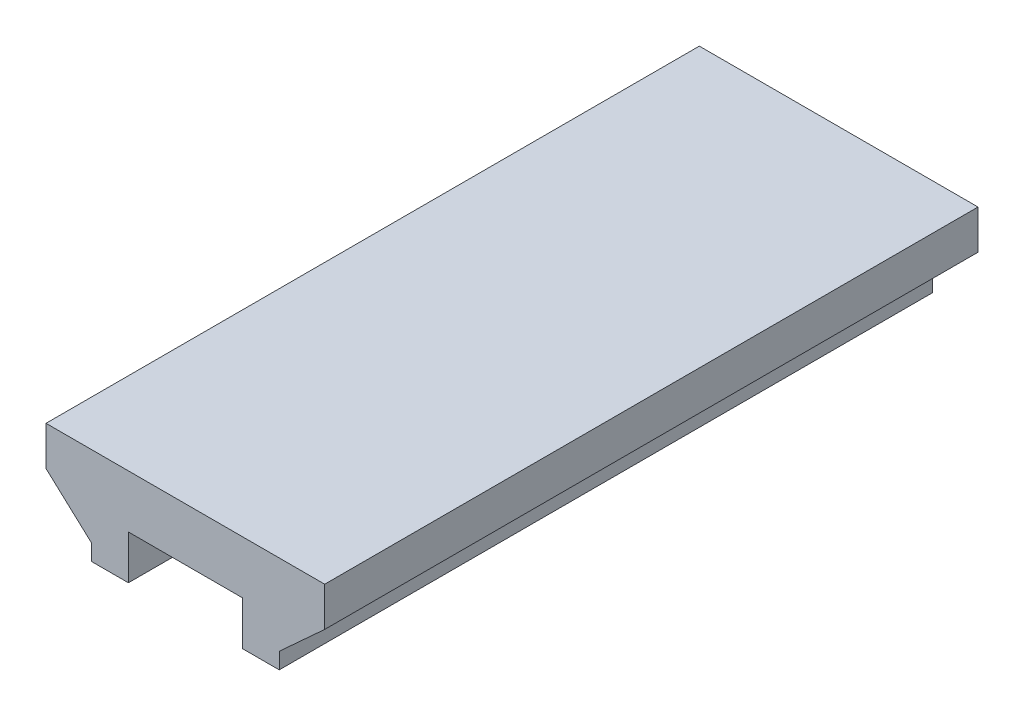
ISO-10303-21;
HEADER;
FILE_DESCRIPTION(('STEP AP214'),'2;1');
FILE_NAME('part.step','',(''),(''),'','','');
FILE_SCHEMA(('AUTOMOTIVE_DESIGN { 1 0 10303 214 1 1 1 1 }'));
ENDSEC;
DATA;
#1=APPLICATION_CONTEXT('core data for automotive mechanical design processes');
#2=APPLICATION_PROTOCOL_DEFINITION('international standard','automotive_design',2000,#1);
#3=PRODUCT_CONTEXT('',#1,'mechanical');
#4=PRODUCT('Part','Part','',(#3));
#5=PRODUCT_RELATED_PRODUCT_CATEGORY('part','',(#4));
#6=PRODUCT_DEFINITION_FORMATION('','',#4);
#7=PRODUCT_DEFINITION_CONTEXT('part definition',#1,'design');
#8=PRODUCT_DEFINITION('design','',#6,#7);
#9=PRODUCT_DEFINITION_SHAPE('','',#8);
#10=(LENGTH_UNIT() NAMED_UNIT(*) SI_UNIT(.MILLI.,.METRE.));
#11=(NAMED_UNIT(*) PLANE_ANGLE_UNIT() SI_UNIT($,.RADIAN.));
#12=(NAMED_UNIT(*) SI_UNIT($,.STERADIAN.) SOLID_ANGLE_UNIT());
#13=UNCERTAINTY_MEASURE_WITH_UNIT(LENGTH_MEASURE(1.E-05),#10,'distance_accuracy_value','');
#14=(GEOMETRIC_REPRESENTATION_CONTEXT(3) GLOBAL_UNCERTAINTY_ASSIGNED_CONTEXT((#13)) GLOBAL_UNIT_ASSIGNED_CONTEXT((#10,
#11,#12)) REPRESENTATION_CONTEXT('',''));
#15=CARTESIAN_POINT('',(0.,0.,0.));
#16=DIRECTION('',(0.,0.,1.));
#17=DIRECTION('',(1.,0.,0.));
#18=AXIS2_PLACEMENT_3D('',#15,#16,#17);
#19=CARTESIAN_POINT('',(20.6600264011001,1430.,-89.8499999999971));
#20=DIRECTION('',(0.,0.,1.));
#21=DIRECTION('',(1.,0.,0.));
#22=AXIS2_PLACEMENT_3D('',#19,#20,#21);
#23=PLANE('',#22);
#24=DIRECTION('',(0.737562216224667,0.67527918463237,0.));
#25=VECTOR('',#24,1.);
#26=CARTESIAN_POINT('',(-167.5,1561.,-89.8499999999971));
#27=LINE('',#26,#25);
#28=CARTESIAN_POINT('',(-167.5,1561.,-89.8499999999971));
#29=VERTEX_POINT('',#28);
#30=CARTESIAN_POINT('',(-55.,1664.,-89.8499999999971));
#31=VERTEX_POINT('',#30);
#32=EDGE_CURVE('E41',#29,#31,#27,.T.);
#33=ORIENTED_EDGE('',*,*,#32,.F.);
#34=DIRECTION('',(0.,1.,0.));
#35=VECTOR('',#34,1.);
#36=CARTESIAN_POINT('',(-167.5,1521.,-89.8499999999971));
#37=LINE('',#36,#35);
#38=CARTESIAN_POINT('',(-167.5,1521.,-89.8499999999971));
#39=VERTEX_POINT('',#38);
#40=EDGE_CURVE('E254',#39,#29,#37,.T.);
#41=ORIENTED_EDGE('',*,*,#40,.F.);
#42=DIRECTION('',(1.,0.,0.));
#43=VECTOR('',#42,1.);
#44=CARTESIAN_POINT('',(-259.,1521.,-89.8499999999971));
#45=LINE('',#44,#43);
#46=CARTESIAN_POINT('',(-259.,1521.,-89.8499999999971));
#47=VERTEX_POINT('',#46);
#48=EDGE_CURVE('E196',#47,#39,#45,.T.);
#49=ORIENTED_EDGE('',*,*,#48,.F.);
#50=DIRECTION('',(0.,-1.,0.));
#51=VECTOR('',#50,1.);
#52=CARTESIAN_POINT('',(-259.,1630.,-89.8499999999971));
#53=LINE('',#52,#51);
#54=CARTESIAN_POINT('',(-259.,1630.,-89.8499999999971));
#55=VERTEX_POINT('',#54);
#56=EDGE_CURVE('E195',#55,#47,#53,.T.);
#57=ORIENTED_EDGE('',*,*,#56,.F.);
#58=DIRECTION('',(1.,0.,0.));
#59=VECTOR('',#58,1.);
#60=CARTESIAN_POINT('',(-541.,1630.,-89.8499999999971));
#61=LINE('',#60,#59);
#62=CARTESIAN_POINT('',(-541.,1630.,-89.8499999999971));
#63=VERTEX_POINT('',#62);
#64=EDGE_CURVE('E203',#63,#55,#61,.T.);
#65=ORIENTED_EDGE('',*,*,#64,.F.);
#66=DIRECTION('',(0.,1.,0.));
#67=VECTOR('',#66,1.);
#68=CARTESIAN_POINT('',(-541.,1521.,-89.8499999999971));
#69=LINE('',#68,#67);
#70=CARTESIAN_POINT('',(-541.,1521.,-89.8499999999971));
#71=VERTEX_POINT('',#70);
#72=EDGE_CURVE('E153',#71,#63,#69,.T.);
#73=ORIENTED_EDGE('',*,*,#72,.F.);
#74=DIRECTION('',(1.,0.,0.));
#75=VECTOR('',#74,1.);
#76=CARTESIAN_POINT('',(-632.,1521.,-89.8499999999971));
#77=LINE('',#76,#75);
#78=CARTESIAN_POINT('',(-632.,1521.,-89.8499999999971));
#79=VERTEX_POINT('',#78);
#80=EDGE_CURVE('E148',#79,#71,#77,.T.);
#81=ORIENTED_EDGE('',*,*,#80,.F.);
#82=DIRECTION('',(0.,-1.,0.));
#83=VECTOR('',#82,1.);
#84=CARTESIAN_POINT('',(-632.,1560.54222222222,-89.8499999999971));
#85=LINE('',#84,#83);
#86=CARTESIAN_POINT('',(-632.,1560.54222222222,-89.8499999999971));
#87=VERTEX_POINT('',#86);
#88=EDGE_CURVE('E150',#87,#79,#85,.T.);
#89=ORIENTED_EDGE('',*,*,#88,.F.);
#90=DIRECTION('',(0.737562216224667,-0.67527918463237,0.));
#91=VECTOR('',#90,1.);
#92=CARTESIAN_POINT('',(-745.,1664.,-89.8499999999971));
#93=LINE('',#92,#91);
#94=CARTESIAN_POINT('',(-745.,1664.,-89.8499999999971));
#95=VERTEX_POINT('',#94);
#96=EDGE_CURVE('E176',#95,#87,#93,.T.);
#97=ORIENTED_EDGE('',*,*,#96,.F.);
#98=DIRECTION('',(0.,1.,0.));
#99=VECTOR('',#98,1.);
#100=CARTESIAN_POINT('',(-745.,1664.,-89.8499999999971));
#101=LINE('',#100,#99);
#102=CARTESIAN_POINT('',(-745.,1761.,-89.8499999999971));
#103=VERTEX_POINT('',#102);
#104=EDGE_CURVE('E11',#95,#103,#101,.T.);
#105=ORIENTED_EDGE('',*,*,#104,.T.);
#106=DIRECTION('',(-1.,0.,0.));
#107=VECTOR('',#106,1.);
#108=CARTESIAN_POINT('',(-55.,1761.,-89.8499999999971));
#109=LINE('',#108,#107);
#110=CARTESIAN_POINT('',(-55.,1761.,-89.8499999999971));
#111=VERTEX_POINT('',#110);
#112=EDGE_CURVE('E128',#111,#103,#109,.T.);
#113=ORIENTED_EDGE('',*,*,#112,.F.);
#114=DIRECTION('',(0.,1.,0.));
#115=VECTOR('',#114,1.);
#116=CARTESIAN_POINT('',(-55.,1664.,-89.8499999999971));
#117=LINE('',#116,#115);
#118=EDGE_CURVE('E28',#31,#111,#117,.T.);
#119=ORIENTED_EDGE('',*,*,#118,.F.);
#120=EDGE_LOOP('',(#33,#41,#49,#57,#65,#73,#81,#89,#97,#105,#113,#119));
#121=FACE_BOUND('',#120,.T.);
#122=ADVANCED_FACE('F17',(#121),#23,.F.);
#123=CARTESIAN_POINT('',(-55.,1664.,-89.8499999999971));
#124=DIRECTION('',(1.,0.,0.));
#125=DIRECTION('',(0.,0.,1.));
#126=AXIS2_PLACEMENT_3D('',#123,#124,#125);
#127=PLANE('',#126);
#128=DIRECTION('',(0.,0.,1.));
#129=VECTOR('',#128,1.);
#130=CARTESIAN_POINT('',(-55.,1664.,-89.8499999999971));
#131=LINE('',#130,#129);
#132=CARTESIAN_POINT('',(-55.,1664.,1527.65));
#133=VERTEX_POINT('',#132);
#134=EDGE_CURVE('E257',#31,#133,#131,.T.);
#135=ORIENTED_EDGE('',*,*,#134,.F.);
#136=ORIENTED_EDGE('',*,*,#118,.T.);
#137=DIRECTION('',(0.,0.,-1.));
#138=VECTOR('',#137,1.);
#139=CARTESIAN_POINT('',(-55.,1761.,1527.65));
#140=LINE('',#139,#138);
#141=CARTESIAN_POINT('',(-55.,1761.,1527.65));
#142=VERTEX_POINT('',#141);
#143=EDGE_CURVE('E185',#142,#111,#140,.T.);
#144=ORIENTED_EDGE('',*,*,#143,.F.);
#145=DIRECTION('',(0.,-1.,0.));
#146=VECTOR('',#145,1.);
#147=CARTESIAN_POINT('',(-55.,1761.,1527.65));
#148=LINE('',#147,#146);
#149=EDGE_CURVE('E207',#142,#133,#148,.T.);
#150=ORIENTED_EDGE('',*,*,#149,.T.);
#151=EDGE_LOOP('',(#135,#136,#144,#150));
#152=FACE_BOUND('',#151,.T.);
#153=ADVANCED_FACE('F281',(#152),#127,.T.);
#154=CARTESIAN_POINT('',(-400.,1521.,1527.65));
#155=DIRECTION('',(0.,0.,1.));
#156=DIRECTION('',(1.,0.,0.));
#157=AXIS2_PLACEMENT_3D('',#154,#155,#156);
#158=PLANE('',#157);
#159=DIRECTION('',(0.737562216224667,-0.67527918463237,0.));
#160=VECTOR('',#159,1.);
#161=CARTESIAN_POINT('',(-745.,1664.,1527.65));
#162=LINE('',#161,#160);
#163=CARTESIAN_POINT('',(-745.,1664.,1527.65));
#164=VERTEX_POINT('',#163);
#165=CARTESIAN_POINT('',(-632.,1560.54222222222,1527.65));
#166=VERTEX_POINT('',#165);
#167=EDGE_CURVE('E215',#164,#166,#162,.T.);
#168=ORIENTED_EDGE('',*,*,#167,.T.);
#169=DIRECTION('',(0.,-1.,0.));
#170=VECTOR('',#169,1.);
#171=CARTESIAN_POINT('',(-632.,1560.54222222222,1527.65));
#172=LINE('',#171,#170);
#173=CARTESIAN_POINT('',(-632.,1521.,1527.65));
#174=VERTEX_POINT('',#173);
#175=EDGE_CURVE('E212',#166,#174,#172,.T.);
#176=ORIENTED_EDGE('',*,*,#175,.T.);
#177=DIRECTION('',(1.,0.,0.));
#178=VECTOR('',#177,1.);
#179=CARTESIAN_POINT('',(-632.,1521.,1527.65));
#180=LINE('',#179,#178);
#181=CARTESIAN_POINT('',(-541.,1521.,1527.65));
#182=VERTEX_POINT('',#181);
#183=EDGE_CURVE('E173',#174,#182,#180,.T.);
#184=ORIENTED_EDGE('',*,*,#183,.T.);
#185=DIRECTION('',(0.,1.,0.));
#186=VECTOR('',#185,1.);
#187=CARTESIAN_POINT('',(-541.,1521.,1527.65));
#188=LINE('',#187,#186);
#189=CARTESIAN_POINT('',(-541.,1630.,1527.65));
#190=VERTEX_POINT('',#189);
#191=EDGE_CURVE('E227',#182,#190,#188,.T.);
#192=ORIENTED_EDGE('',*,*,#191,.T.);
#193=DIRECTION('',(1.,0.,0.));
#194=VECTOR('',#193,1.);
#195=CARTESIAN_POINT('',(-541.,1630.,1527.65));
#196=LINE('',#195,#194);
#197=CARTESIAN_POINT('',(-259.,1630.,1527.65));
#198=VERTEX_POINT('',#197);
#199=EDGE_CURVE('E223',#190,#198,#196,.T.);
#200=ORIENTED_EDGE('',*,*,#199,.T.);
#201=DIRECTION('',(0.,-1.,0.));
#202=VECTOR('',#201,1.);
#203=CARTESIAN_POINT('',(-259.,1630.,1527.65));
#204=LINE('',#203,#202);
#205=CARTESIAN_POINT('',(-259.,1521.,1527.65));
#206=VERTEX_POINT('',#205);
#207=EDGE_CURVE('E228',#198,#206,#204,.T.);
#208=ORIENTED_EDGE('',*,*,#207,.T.);
#209=DIRECTION('',(1.,0.,0.));
#210=VECTOR('',#209,1.);
#211=CARTESIAN_POINT('',(-259.,1521.,1527.65));
#212=LINE('',#211,#210);
#213=CARTESIAN_POINT('',(-167.5,1521.,1527.65));
#214=VERTEX_POINT('',#213);
#215=EDGE_CURVE('E182',#206,#214,#212,.T.);
#216=ORIENTED_EDGE('',*,*,#215,.T.);
#217=DIRECTION('',(0.,1.,0.));
#218=VECTOR('',#217,1.);
#219=CARTESIAN_POINT('',(-167.5,1521.,1527.65));
#220=LINE('',#219,#218);
#221=CARTESIAN_POINT('',(-167.5,1561.,1527.65));
#222=VERTEX_POINT('',#221);
#223=EDGE_CURVE('E74',#214,#222,#220,.T.);
#224=ORIENTED_EDGE('',*,*,#223,.T.);
#225=DIRECTION('',(0.737562216224667,0.67527918463237,0.));
#226=VECTOR('',#225,1.);
#227=CARTESIAN_POINT('',(-167.5,1561.,1527.65));
#228=LINE('',#227,#226);
#229=EDGE_CURVE('E87',#222,#133,#228,.T.);
#230=ORIENTED_EDGE('',*,*,#229,.T.);
#231=ORIENTED_EDGE('',*,*,#149,.F.);
#232=DIRECTION('',(1.,0.,0.));
#233=VECTOR('',#232,1.);
#234=CARTESIAN_POINT('',(-745.,1761.,1527.65));
#235=LINE('',#234,#233);
#236=CARTESIAN_POINT('',(-745.,1761.,1527.65));
#237=VERTEX_POINT('',#236);
#238=EDGE_CURVE('E188',#237,#142,#235,.T.);
#239=ORIENTED_EDGE('',*,*,#238,.F.);
#240=DIRECTION('',(0.,1.,0.));
#241=VECTOR('',#240,1.);
#242=CARTESIAN_POINT('',(-745.,1664.,1527.65));
#243=LINE('',#242,#241);
#244=EDGE_CURVE('E222',#164,#237,#243,.T.);
#245=ORIENTED_EDGE('',*,*,#244,.F.);
#246=EDGE_LOOP('',(#168,#176,#184,#192,#200,#208,#216,#224,#230,#231,#239,#245));
#247=FACE_BOUND('',#246,.T.);
#248=ADVANCED_FACE('F285',(#247),#158,.T.);
#249=CARTESIAN_POINT('',(-745.,1693.,-89.8499999999971));
#250=DIRECTION('',(-1.,0.,0.));
#251=DIRECTION('',(0.,-1.,0.));
#252=AXIS2_PLACEMENT_3D('',#249,#250,#251);
#253=PLANE('',#252);
#254=DIRECTION('',(0.,0.,1.));
#255=VECTOR('',#254,1.);
#256=CARTESIAN_POINT('',(-745.,1664.,-89.8499999999971));
#257=LINE('',#256,#255);
#258=EDGE_CURVE('E218',#95,#164,#257,.T.);
#259=ORIENTED_EDGE('',*,*,#258,.T.);
#260=ORIENTED_EDGE('',*,*,#244,.T.);
#261=DIRECTION('',(0.,0.,1.));
#262=VECTOR('',#261,1.);
#263=CARTESIAN_POINT('',(-745.,1761.,-89.8499999999971));
#264=LINE('',#263,#262);
#265=EDGE_CURVE('E249',#103,#237,#264,.T.);
#266=ORIENTED_EDGE('',*,*,#265,.F.);
#267=ORIENTED_EDGE('',*,*,#104,.F.);
#268=EDGE_LOOP('',(#259,#260,#266,#267));
#269=FACE_BOUND('',#268,.T.);
#270=ADVANCED_FACE('F298',(#269),#253,.T.);
#271=CARTESIAN_POINT('',(20.6600264011001,1761.,-89.8499999999971));
#272=DIRECTION('',(0.,1.,0.));
#273=DIRECTION('',(0.,0.,-1.));
#274=AXIS2_PLACEMENT_3D('',#271,#272,#273);
#275=PLANE('',#274);
#276=ORIENTED_EDGE('',*,*,#112,.T.);
#277=ORIENTED_EDGE('',*,*,#265,.T.);
#278=ORIENTED_EDGE('',*,*,#238,.T.);
#279=ORIENTED_EDGE('',*,*,#143,.T.);
#280=EDGE_LOOP('',(#276,#277,#278,#279));
#281=FACE_BOUND('',#280,.T.);
#282=ADVANCED_FACE('F295',(#281),#275,.T.);
#283=CARTESIAN_POINT('',(-745.,1664.,-89.8499999999971));
#284=DIRECTION('',(-0.67527918463237,-0.737562216224667,0.));
#285=DIRECTION('',(0.,0.,1.));
#286=AXIS2_PLACEMENT_3D('',#283,#284,#285);
#287=PLANE('',#286);
#288=DIRECTION('',(0.,0.,1.));
#289=VECTOR('',#288,1.);
#290=CARTESIAN_POINT('',(-632.,1560.54222222222,-89.8499999999971));
#291=LINE('',#290,#289);
#292=EDGE_CURVE('E168',#87,#166,#291,.T.);
#293=ORIENTED_EDGE('',*,*,#292,.T.);
#294=ORIENTED_EDGE('',*,*,#167,.F.);
#295=ORIENTED_EDGE('',*,*,#258,.F.);
#296=ORIENTED_EDGE('',*,*,#96,.T.);
#297=EDGE_LOOP('',(#293,#294,#295,#296));
#298=FACE_BOUND('',#297,.T.);
#299=ADVANCED_FACE('F302',(#298),#287,.T.);
#300=CARTESIAN_POINT('',(-632.,1560.54222222222,-89.8499999999971));
#301=DIRECTION('',(-1.,0.,0.));
#302=DIRECTION('',(0.,-1.,0.));
#303=AXIS2_PLACEMENT_3D('',#300,#301,#302);
#304=PLANE('',#303);
#305=DIRECTION('',(0.,0.,1.));
#306=VECTOR('',#305,1.);
#307=CARTESIAN_POINT('',(-632.,1521.,-89.8499999999971));
#308=LINE('',#307,#306);
#309=EDGE_CURVE('E166',#79,#174,#308,.T.);
#310=ORIENTED_EDGE('',*,*,#309,.T.);
#311=ORIENTED_EDGE('',*,*,#175,.F.);
#312=ORIENTED_EDGE('',*,*,#292,.F.);
#313=ORIENTED_EDGE('',*,*,#88,.T.);
#314=EDGE_LOOP('',(#310,#311,#312,#313));
#315=FACE_BOUND('',#314,.T.);
#316=ADVANCED_FACE('F164',(#315),#304,.T.);
#317=CARTESIAN_POINT('',(-632.,1521.,-89.8499999999971));
#318=DIRECTION('',(0.,-1.,0.));
#319=DIRECTION('',(1.,0.,0.));
#320=AXIS2_PLACEMENT_3D('',#317,#318,#319);
#321=PLANE('',#320);
#322=DIRECTION('',(0.,0.,1.));
#323=VECTOR('',#322,1.);
#324=CARTESIAN_POINT('',(-541.,1521.,-89.8499999999971));
#325=LINE('',#324,#323);
#326=EDGE_CURVE('E21',#71,#182,#325,.T.);
#327=ORIENTED_EDGE('',*,*,#326,.T.);
#328=ORIENTED_EDGE('',*,*,#183,.F.);
#329=ORIENTED_EDGE('',*,*,#309,.F.);
#330=ORIENTED_EDGE('',*,*,#80,.T.);
#331=EDGE_LOOP('',(#327,#328,#329,#330));
#332=FACE_BOUND('',#331,.T.);
#333=ADVANCED_FACE('F171',(#332),#321,.T.);
#334=CARTESIAN_POINT('',(-541.,1521.,-89.8499999999971));
#335=DIRECTION('',(1.,0.,0.));
#336=DIRECTION('',(0.,0.,1.));
#337=AXIS2_PLACEMENT_3D('',#334,#335,#336);
#338=PLANE('',#337);
#339=DIRECTION('',(0.,0.,1.));
#340=VECTOR('',#339,1.);
#341=CARTESIAN_POINT('',(-541.,1630.,-89.8499999999971));
#342=LINE('',#341,#340);
#343=EDGE_CURVE('E159',#63,#190,#342,.T.);
#344=ORIENTED_EDGE('',*,*,#343,.T.);
#345=ORIENTED_EDGE('',*,*,#191,.F.);
#346=ORIENTED_EDGE('',*,*,#326,.F.);
#347=ORIENTED_EDGE('',*,*,#72,.T.);
#348=EDGE_LOOP('',(#344,#345,#346,#347));
#349=FACE_BOUND('',#348,.T.);
#350=ADVANCED_FACE('F312',(#349),#338,.T.);
#351=CARTESIAN_POINT('',(-541.,1630.,-89.8499999999971));
#352=DIRECTION('',(0.,-1.,0.));
#353=DIRECTION('',(1.,0.,0.));
#354=AXIS2_PLACEMENT_3D('',#351,#352,#353);
#355=PLANE('',#354);
#356=DIRECTION('',(0.,0.,1.));
#357=VECTOR('',#356,1.);
#358=CARTESIAN_POINT('',(-259.,1630.,-89.8499999999971));
#359=LINE('',#358,#357);
#360=EDGE_CURVE('E210',#55,#198,#359,.T.);
#361=ORIENTED_EDGE('',*,*,#360,.T.);
#362=ORIENTED_EDGE('',*,*,#199,.F.);
#363=ORIENTED_EDGE('',*,*,#343,.F.);
#364=ORIENTED_EDGE('',*,*,#64,.T.);
#365=EDGE_LOOP('',(#361,#362,#363,#364));
#366=FACE_BOUND('',#365,.T.);
#367=ADVANCED_FACE('F313',(#366),#355,.T.);
#368=CARTESIAN_POINT('',(-259.,1630.,-89.8499999999971));
#369=DIRECTION('',(-1.,0.,0.));
#370=DIRECTION('',(0.,-1.,0.));
#371=AXIS2_PLACEMENT_3D('',#368,#369,#370);
#372=PLANE('',#371);
#373=DIRECTION('',(0.,0.,1.));
#374=VECTOR('',#373,1.);
#375=CARTESIAN_POINT('',(-259.,1521.,-89.8499999999971));
#376=LINE('',#375,#374);
#377=EDGE_CURVE('E200',#47,#206,#376,.T.);
#378=ORIENTED_EDGE('',*,*,#377,.T.);
#379=ORIENTED_EDGE('',*,*,#207,.F.);
#380=ORIENTED_EDGE('',*,*,#360,.F.);
#381=ORIENTED_EDGE('',*,*,#56,.T.);
#382=EDGE_LOOP('',(#378,#379,#380,#381));
#383=FACE_BOUND('',#382,.T.);
#384=ADVANCED_FACE('F315',(#383),#372,.T.);
#385=CARTESIAN_POINT('',(-259.,1521.,-89.8499999999971));
#386=DIRECTION('',(0.,-1.,0.));
#387=DIRECTION('',(1.,0.,0.));
#388=AXIS2_PLACEMENT_3D('',#385,#386,#387);
#389=PLANE('',#388);
#390=DIRECTION('',(0.,0.,1.));
#391=VECTOR('',#390,1.);
#392=CARTESIAN_POINT('',(-167.5,1521.,-89.8499999999971));
#393=LINE('',#392,#391);
#394=EDGE_CURVE('E191',#39,#214,#393,.T.);
#395=ORIENTED_EDGE('',*,*,#394,.T.);
#396=ORIENTED_EDGE('',*,*,#215,.F.);
#397=ORIENTED_EDGE('',*,*,#377,.F.);
#398=ORIENTED_EDGE('',*,*,#48,.T.);
#399=EDGE_LOOP('',(#395,#396,#397,#398));
#400=FACE_BOUND('',#399,.T.);
#401=ADVANCED_FACE('F19',(#400),#389,.T.);
#402=CARTESIAN_POINT('',(-167.5,1521.,-89.8499999999971));
#403=DIRECTION('',(1.,0.,0.));
#404=DIRECTION('',(0.,0.,1.));
#405=AXIS2_PLACEMENT_3D('',#402,#403,#404);
#406=PLANE('',#405);
#407=DIRECTION('',(0.,0.,1.));
#408=VECTOR('',#407,1.);
#409=CARTESIAN_POINT('',(-167.5,1561.,-89.8499999999971));
#410=LINE('',#409,#408);
#411=EDGE_CURVE('E251',#29,#222,#410,.T.);
#412=ORIENTED_EDGE('',*,*,#411,.T.);
#413=ORIENTED_EDGE('',*,*,#223,.F.);
#414=ORIENTED_EDGE('',*,*,#394,.F.);
#415=ORIENTED_EDGE('',*,*,#40,.T.);
#416=EDGE_LOOP('',(#412,#413,#414,#415));
#417=FACE_BOUND('',#416,.T.);
#418=ADVANCED_FACE('F275',(#417),#406,.T.);
#419=CARTESIAN_POINT('',(-167.5,1561.,-89.8499999999971));
#420=DIRECTION('',(0.67527918463237,-0.737562216224667,0.));
#421=DIRECTION('',(0.,0.,-1.));
#422=AXIS2_PLACEMENT_3D('',#419,#420,#421);
#423=PLANE('',#422);
#424=ORIENTED_EDGE('',*,*,#134,.T.);
#425=ORIENTED_EDGE('',*,*,#229,.F.);
#426=ORIENTED_EDGE('',*,*,#411,.F.);
#427=ORIENTED_EDGE('',*,*,#32,.T.);
#428=EDGE_LOOP('',(#424,#425,#426,#427));
#429=FACE_BOUND('',#428,.T.);
#430=ADVANCED_FACE('F277',(#429),#423,.T.);
#431=CLOSED_SHELL('',(#122,#153,#248,#270,#282,#299,#316,#333,#350,#367,#384,#401,#418,#430));
#432=MANIFOLD_SOLID_BREP('B1',#431);
#433=ADVANCED_BREP_SHAPE_REPRESENTATION('',(#18,#432),#14);
#434=SHAPE_DEFINITION_REPRESENTATION(#9,#433);
ENDSEC;
END-ISO-10303-21;
